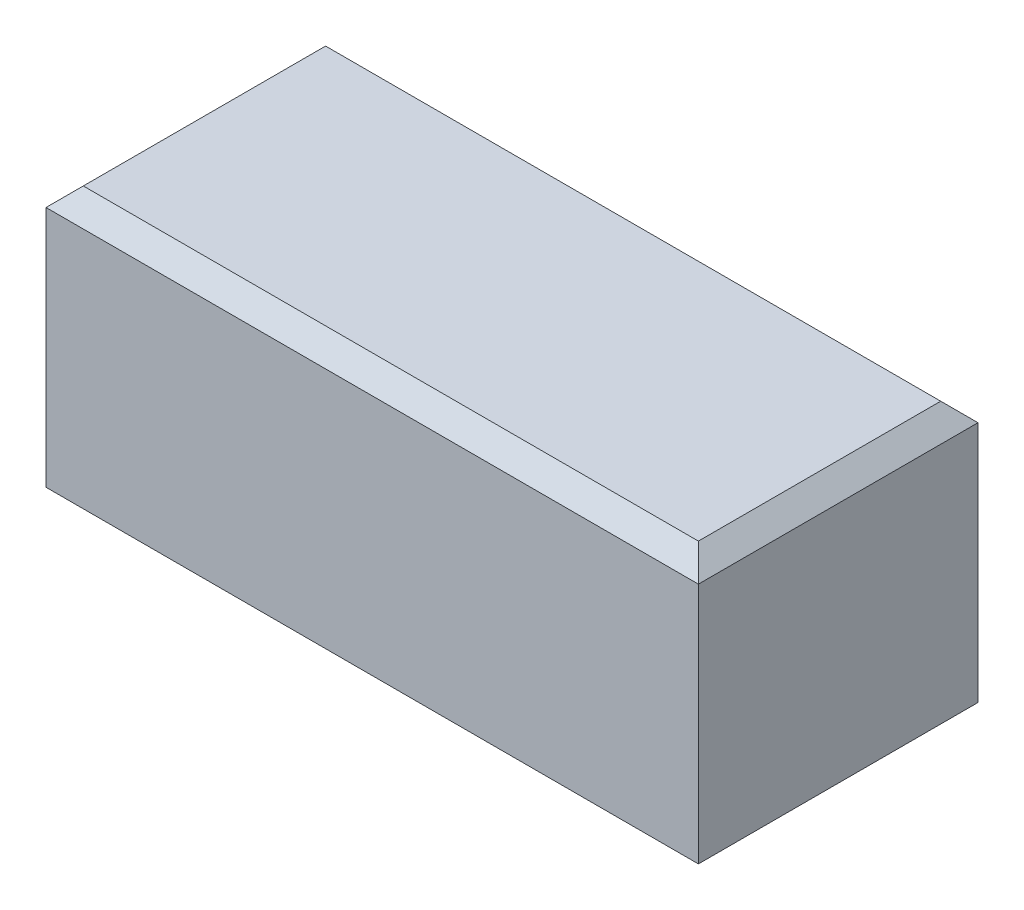
ISO-10303-21;
HEADER;
FILE_DESCRIPTION(('STEP AP214'),'2;1');
FILE_NAME('part.step','',(''),(''),'','','');
FILE_SCHEMA(('AUTOMOTIVE_DESIGN { 1 0 10303 214 1 1 1 1 }'));
ENDSEC;
DATA;
#1=APPLICATION_CONTEXT('core data for automotive mechanical design processes');
#2=APPLICATION_PROTOCOL_DEFINITION('international standard','automotive_design',2000,#1);
#3=PRODUCT_CONTEXT('',#1,'mechanical');
#4=PRODUCT('Part','Part','',(#3));
#5=PRODUCT_RELATED_PRODUCT_CATEGORY('part','',(#4));
#6=PRODUCT_DEFINITION_FORMATION('','',#4);
#7=PRODUCT_DEFINITION_CONTEXT('part definition',#1,'design');
#8=PRODUCT_DEFINITION('design','',#6,#7);
#9=PRODUCT_DEFINITION_SHAPE('','',#8);
#10=(LENGTH_UNIT() NAMED_UNIT(*) SI_UNIT(.MILLI.,.METRE.));
#11=(NAMED_UNIT(*) PLANE_ANGLE_UNIT() SI_UNIT($,.RADIAN.));
#12=(NAMED_UNIT(*) SI_UNIT($,.STERADIAN.) SOLID_ANGLE_UNIT());
#13=UNCERTAINTY_MEASURE_WITH_UNIT(LENGTH_MEASURE(1.E-05),#10,'distance_accuracy_value','');
#14=(GEOMETRIC_REPRESENTATION_CONTEXT(3) GLOBAL_UNCERTAINTY_ASSIGNED_CONTEXT((#13)) GLOBAL_UNIT_ASSIGNED_CONTEXT((#10,
#11,#12)) REPRESENTATION_CONTEXT('',''));
#15=CARTESIAN_POINT('',(0.,0.,0.));
#16=DIRECTION('',(0.,0.,1.));
#17=DIRECTION('',(1.,0.,0.));
#18=AXIS2_PLACEMENT_3D('',#15,#16,#17);
#19=CARTESIAN_POINT('',(0.2,5.8,3.));
#20=DIRECTION('',(0.707106781186548,-0.707106781186547,0.));
#21=DIRECTION('',(-0.707106781186547,-0.707106781186548,0.));
#22=AXIS2_PLACEMENT_3D('',#19,#20,#21);
#23=PLANE('',#22);
#24=DIRECTION('',(0.,0.,-1.));
#25=VECTOR('',#24,1.);
#26=CARTESIAN_POINT('',(0.,5.6,1.5));
#27=LINE('',#26,#25);
#28=CARTESIAN_POINT('',(0.,5.6,3.));
#29=VERTEX_POINT('',#28);
#30=CARTESIAN_POINT('',(0.,5.6,-3.));
#31=VERTEX_POINT('',#30);
#32=EDGE_CURVE('E34',#29,#31,#27,.T.);
#33=ORIENTED_EDGE('',*,*,#32,.F.);
#34=DIRECTION('',(-0.577350269189626,-0.577350269189626,0.577350269189626));
#35=VECTOR('',#34,1.);
#36=CARTESIAN_POINT('',(0.133333333333333,5.73333333333333,2.86666666666666));
#37=LINE('',#36,#35);
#38=CARTESIAN_POINT('',(0.4,6.,2.6));
#39=VERTEX_POINT('',#38);
#40=EDGE_CURVE('E108',#39,#29,#37,.T.);
#41=ORIENTED_EDGE('',*,*,#40,.F.);
#42=DIRECTION('',(0.,0.,1.));
#43=VECTOR('',#42,1.);
#44=CARTESIAN_POINT('',(0.4,6.,1.5));
#45=LINE('',#44,#43);
#46=CARTESIAN_POINT('',(0.4,6.,-2.6));
#47=VERTEX_POINT('',#46);
#48=EDGE_CURVE('E101',#47,#39,#45,.T.);
#49=ORIENTED_EDGE('',*,*,#48,.F.);
#50=DIRECTION('',(0.577350269189626,0.577350269189626,0.577350269189626));
#51=VECTOR('',#50,1.);
#52=CARTESIAN_POINT('',(1.13333333333333,6.73333333333333,-1.86666666666667));
#53=LINE('',#52,#51);
#54=EDGE_CURVE('E9',#31,#47,#53,.T.);
#55=ORIENTED_EDGE('',*,*,#54,.F.);
#56=EDGE_LOOP('',(#33,#41,#49,#55));
#57=FACE_BOUND('',#56,.T.);
#58=ADVANCED_FACE('F15',(#57),#23,.F.);
#59=CARTESIAN_POINT('',(0.,5.8,-2.8));
#60=DIRECTION('',(0.,0.707106781186548,-0.707106781186548));
#61=DIRECTION('',(0.,0.707106781186548,0.707106781186548));
#62=AXIS2_PLACEMENT_3D('',#59,#60,#61);
#63=PLANE('',#62);
#64=ORIENTED_EDGE('',*,*,#54,.T.);
#65=DIRECTION('',(1.,0.,0.));
#66=VECTOR('',#65,1.);
#67=CARTESIAN_POINT('',(0.,6.,-2.6));
#68=LINE('',#67,#66);
#69=CARTESIAN_POINT('',(13.6,6.,-2.6));
#70=VERTEX_POINT('',#69);
#71=EDGE_CURVE('E25',#47,#70,#68,.T.);
#72=ORIENTED_EDGE('',*,*,#71,.T.);
#73=DIRECTION('',(0.577350269189624,-0.577350269189627,-0.577350269189627));
#74=VECTOR('',#73,1.);
#75=CARTESIAN_POINT('',(10.5333333333333,9.06666666666667,0.466666666666667));
#76=LINE('',#75,#74);
#77=CARTESIAN_POINT('',(14.,5.6,-3.));
#78=VERTEX_POINT('',#77);
#79=EDGE_CURVE('E93',#70,#78,#76,.T.);
#80=ORIENTED_EDGE('',*,*,#79,.T.);
#81=DIRECTION('',(1.,0.,0.));
#82=VECTOR('',#81,1.);
#83=CARTESIAN_POINT('',(0.,5.6,-3.));
#84=LINE('',#83,#82);
#85=EDGE_CURVE('E148',#31,#78,#84,.T.);
#86=ORIENTED_EDGE('',*,*,#85,.F.);
#87=EDGE_LOOP('',(#64,#72,#80,#86));
#88=FACE_BOUND('',#87,.T.);
#89=ADVANCED_FACE('F186',(#88),#63,.T.);
#90=CARTESIAN_POINT('',(0.,6.,0.));
#91=DIRECTION('',(0.,1.,0.));
#92=DIRECTION('',(0.,0.,1.));
#93=AXIS2_PLACEMENT_3D('',#90,#91,#92);
#94=PLANE('',#93);
#95=ORIENTED_EDGE('',*,*,#48,.T.);
#96=DIRECTION('',(1.,0.,0.));
#97=VECTOR('',#96,1.);
#98=CARTESIAN_POINT('',(0.,6.,2.6));
#99=LINE('',#98,#97);
#100=CARTESIAN_POINT('',(13.6,6.,2.6));
#101=VERTEX_POINT('',#100);
#102=EDGE_CURVE('E19',#39,#101,#99,.T.);
#103=ORIENTED_EDGE('',*,*,#102,.T.);
#104=DIRECTION('',(0.,0.,-1.));
#105=VECTOR('',#104,1.);
#106=CARTESIAN_POINT('',(13.6,6.,1.5));
#107=LINE('',#106,#105);
#108=EDGE_CURVE('E86',#101,#70,#107,.T.);
#109=ORIENTED_EDGE('',*,*,#108,.T.);
#110=ORIENTED_EDGE('',*,*,#71,.F.);
#111=EDGE_LOOP('',(#95,#103,#109,#110));
#112=FACE_BOUND('',#111,.T.);
#113=ADVANCED_FACE('F17',(#112),#94,.T.);
#114=CARTESIAN_POINT('',(13.8,5.8,3.));
#115=DIRECTION('',(-0.707106781186549,-0.707106781186546,0.));
#116=DIRECTION('',(-0.707106781186546,0.707106781186549,0.));
#117=AXIS2_PLACEMENT_3D('',#114,#115,#116);
#118=PLANE('',#117);
#119=DIRECTION('',(-0.577350269189625,0.577350269189627,-0.577350269189626));
#120=VECTOR('',#119,1.);
#121=CARTESIAN_POINT('',(11.5333333333333,8.06666666666667,0.533333333333338));
#122=LINE('',#121,#120);
#123=CARTESIAN_POINT('',(14.,5.6,3.));
#124=VERTEX_POINT('',#123);
#125=EDGE_CURVE('E91',#124,#101,#122,.T.);
#126=ORIENTED_EDGE('',*,*,#125,.F.);
#127=DIRECTION('',(0.,0.,1.));
#128=VECTOR('',#127,1.);
#129=CARTESIAN_POINT('',(14.,5.6,1.5));
#130=LINE('',#129,#128);
#131=EDGE_CURVE('E97',#78,#124,#130,.T.);
#132=ORIENTED_EDGE('',*,*,#131,.F.);
#133=ORIENTED_EDGE('',*,*,#79,.F.);
#134=ORIENTED_EDGE('',*,*,#108,.F.);
#135=EDGE_LOOP('',(#126,#132,#133,#134));
#136=FACE_BOUND('',#135,.T.);
#137=ADVANCED_FACE('F88',(#136),#118,.F.);
#138=CARTESIAN_POINT('',(14.,3.,0.));
#139=DIRECTION('',(1.,0.,0.));
#140=DIRECTION('',(0.,0.,-1.));
#141=AXIS2_PLACEMENT_3D('',#138,#139,#140);
#142=PLANE('',#141);
#143=ORIENTED_EDGE('',*,*,#131,.T.);
#144=DIRECTION('',(0.,1.,0.));
#145=VECTOR('',#144,1.);
#146=CARTESIAN_POINT('',(14.,5.6,3.));
#147=LINE('',#146,#145);
#148=CARTESIAN_POINT('',(14.,0.4,3.));
#149=VERTEX_POINT('',#148);
#150=EDGE_CURVE('E64',#149,#124,#147,.T.);
#151=ORIENTED_EDGE('',*,*,#150,.F.);
#152=DIRECTION('',(0.,0.,-1.));
#153=VECTOR('',#152,1.);
#154=CARTESIAN_POINT('',(14.,0.4,1.5));
#155=LINE('',#154,#153);
#156=CARTESIAN_POINT('',(14.,0.4,-3.));
#157=VERTEX_POINT('',#156);
#158=EDGE_CURVE('E135',#149,#157,#155,.T.);
#159=ORIENTED_EDGE('',*,*,#158,.T.);
#160=DIRECTION('',(0.,-1.,0.));
#161=VECTOR('',#160,1.);
#162=CARTESIAN_POINT('',(14.,0.4,-3.));
#163=LINE('',#162,#161);
#164=EDGE_CURVE('E74',#78,#157,#163,.T.);
#165=ORIENTED_EDGE('',*,*,#164,.F.);
#166=EDGE_LOOP('',(#143,#151,#159,#165));
#167=FACE_BOUND('',#166,.T.);
#168=ADVANCED_FACE('F193',(#167),#142,.T.);
#169=CARTESIAN_POINT('',(13.8,0.2,3.));
#170=DIRECTION('',(-0.707106781186549,0.707106781186547,0.));
#171=DIRECTION('',(0.707106781186547,0.707106781186549,0.));
#172=AXIS2_PLACEMENT_3D('',#169,#170,#171);
#173=PLANE('',#172);
#174=ORIENTED_EDGE('',*,*,#158,.F.);
#175=DIRECTION('',(0.577350269189625,0.577350269189626,0.577350269189626));
#176=VECTOR('',#175,1.);
#177=CARTESIAN_POINT('',(11.5333333333333,-2.06666666666667,0.533333333333335));
#178=LINE('',#177,#176);
#179=CARTESIAN_POINT('',(13.6,0.,2.6));
#180=VERTEX_POINT('',#179);
#181=EDGE_CURVE('E117',#180,#149,#178,.T.);
#182=ORIENTED_EDGE('',*,*,#181,.F.);
#183=DIRECTION('',(0.,0.,1.));
#184=VECTOR('',#183,1.);
#185=CARTESIAN_POINT('',(13.6,0.,1.5));
#186=LINE('',#185,#184);
#187=CARTESIAN_POINT('',(13.6,0.,-2.6));
#188=VERTEX_POINT('',#187);
#189=EDGE_CURVE('E129',#188,#180,#186,.T.);
#190=ORIENTED_EDGE('',*,*,#189,.F.);
#191=DIRECTION('',(-0.577350269189624,-0.577350269189626,0.577350269189627));
#192=VECTOR('',#191,1.);
#193=CARTESIAN_POINT('',(10.5333333333333,-3.06666666666667,0.466666666666669));
#194=LINE('',#193,#192);
#195=EDGE_CURVE('E132',#157,#188,#194,.T.);
#196=ORIENTED_EDGE('',*,*,#195,.F.);
#197=EDGE_LOOP('',(#174,#182,#190,#196));
#198=FACE_BOUND('',#197,.T.);
#199=ADVANCED_FACE('F201',(#198),#173,.F.);
#200=CARTESIAN_POINT('',(0.,0.2,-2.8));
#201=DIRECTION('',(0.,-0.707106781186548,-0.707106781186547));
#202=DIRECTION('',(0.,0.707106781186547,-0.707106781186548));
#203=AXIS2_PLACEMENT_3D('',#200,#201,#202);
#204=PLANE('',#203);
#205=ORIENTED_EDGE('',*,*,#195,.T.);
#206=DIRECTION('',(1.,0.,0.));
#207=VECTOR('',#206,1.);
#208=CARTESIAN_POINT('',(0.,0.,-2.6));
#209=LINE('',#208,#207);
#210=CARTESIAN_POINT('',(0.4,0.,-2.6));
#211=VERTEX_POINT('',#210);
#212=EDGE_CURVE('E130',#211,#188,#209,.T.);
#213=ORIENTED_EDGE('',*,*,#212,.F.);
#214=DIRECTION('',(-0.577350269189626,0.577350269189626,-0.577350269189626));
#215=VECTOR('',#214,1.);
#216=CARTESIAN_POINT('',(1.13333333333333,-0.733333333333334,-1.86666666666667));
#217=LINE('',#216,#215);
#218=CARTESIAN_POINT('',(0.,0.4,-3.));
#219=VERTEX_POINT('',#218);
#220=EDGE_CURVE('E136',#211,#219,#217,.T.);
#221=ORIENTED_EDGE('',*,*,#220,.T.);
#222=DIRECTION('',(1.,0.,0.));
#223=VECTOR('',#222,1.);
#224=CARTESIAN_POINT('',(0.,0.4,-3.));
#225=LINE('',#224,#223);
#226=EDGE_CURVE('E143',#219,#157,#225,.T.);
#227=ORIENTED_EDGE('',*,*,#226,.T.);
#228=EDGE_LOOP('',(#205,#213,#221,#227));
#229=FACE_BOUND('',#228,.T.);
#230=ADVANCED_FACE('F168',(#229),#204,.T.);
#231=CARTESIAN_POINT('',(0.,0.,0.));
#232=DIRECTION('',(0.,-1.,0.));
#233=DIRECTION('',(0.,0.,-1.));
#234=AXIS2_PLACEMENT_3D('',#231,#232,#233);
#235=PLANE('',#234);
#236=ORIENTED_EDGE('',*,*,#189,.T.);
#237=DIRECTION('',(1.,0.,0.));
#238=VECTOR('',#237,1.);
#239=CARTESIAN_POINT('',(0.,0.,2.6));
#240=LINE('',#239,#238);
#241=CARTESIAN_POINT('',(0.4,0.,2.6));
#242=VERTEX_POINT('',#241);
#243=EDGE_CURVE('E118',#242,#180,#240,.T.);
#244=ORIENTED_EDGE('',*,*,#243,.F.);
#245=DIRECTION('',(0.,0.,-1.));
#246=VECTOR('',#245,1.);
#247=CARTESIAN_POINT('',(0.4,0.,1.5));
#248=LINE('',#247,#246);
#249=EDGE_CURVE('E126',#242,#211,#248,.T.);
#250=ORIENTED_EDGE('',*,*,#249,.T.);
#251=ORIENTED_EDGE('',*,*,#212,.T.);
#252=EDGE_LOOP('',(#236,#244,#250,#251));
#253=FACE_BOUND('',#252,.T.);
#254=ADVANCED_FACE('F234',(#253),#235,.T.);
#255=CARTESIAN_POINT('',(0.2,0.2,3.));
#256=DIRECTION('',(0.707106781186548,0.707106781186548,0.));
#257=DIRECTION('',(0.707106781186548,-0.707106781186548,0.));
#258=AXIS2_PLACEMENT_3D('',#255,#256,#257);
#259=PLANE('',#258);
#260=DIRECTION('',(0.,0.,1.));
#261=VECTOR('',#260,1.);
#262=CARTESIAN_POINT('',(0.,0.4,1.5));
#263=LINE('',#262,#261);
#264=CARTESIAN_POINT('',(0.,0.4,3.));
#265=VERTEX_POINT('',#264);
#266=EDGE_CURVE('E137',#219,#265,#263,.T.);
#267=ORIENTED_EDGE('',*,*,#266,.F.);
#268=ORIENTED_EDGE('',*,*,#220,.F.);
#269=ORIENTED_EDGE('',*,*,#249,.F.);
#270=DIRECTION('',(0.577350269189626,-0.577350269189626,-0.577350269189626));
#271=VECTOR('',#270,1.);
#272=CARTESIAN_POINT('',(0.133333333333333,0.266666666666666,2.86666666666666));
#273=LINE('',#272,#271);
#274=EDGE_CURVE('E114',#265,#242,#273,.T.);
#275=ORIENTED_EDGE('',*,*,#274,.F.);
#276=EDGE_LOOP('',(#267,#268,#269,#275));
#277=FACE_BOUND('',#276,.T.);
#278=ADVANCED_FACE('F240',(#277),#259,.F.);
#279=CARTESIAN_POINT('',(0.,0.2,2.8));
#280=DIRECTION('',(0.,-0.707106781186548,0.707106781186548));
#281=DIRECTION('',(0.,-0.707106781186548,-0.707106781186548));
#282=AXIS2_PLACEMENT_3D('',#279,#280,#281);
#283=PLANE('',#282);
#284=ORIENTED_EDGE('',*,*,#181,.T.);
#285=DIRECTION('',(1.,0.,0.));
#286=VECTOR('',#285,1.);
#287=CARTESIAN_POINT('',(0.,0.4,3.));
#288=LINE('',#287,#286);
#289=EDGE_CURVE('E122',#265,#149,#288,.T.);
#290=ORIENTED_EDGE('',*,*,#289,.F.);
#291=ORIENTED_EDGE('',*,*,#274,.T.);
#292=ORIENTED_EDGE('',*,*,#243,.T.);
#293=EDGE_LOOP('',(#284,#290,#291,#292));
#294=FACE_BOUND('',#293,.T.);
#295=ADVANCED_FACE('F247',(#294),#283,.T.);
#296=CARTESIAN_POINT('',(0.,3.,3.));
#297=DIRECTION('',(0.,0.,1.));
#298=DIRECTION('',(0.,-1.,0.));
#299=AXIS2_PLACEMENT_3D('',#296,#297,#298);
#300=PLANE('',#299);
#301=ORIENTED_EDGE('',*,*,#150,.T.);
#302=DIRECTION('',(1.,0.,0.));
#303=VECTOR('',#302,1.);
#304=CARTESIAN_POINT('',(0.,5.6,3.));
#305=LINE('',#304,#303);
#306=EDGE_CURVE('E106',#29,#124,#305,.T.);
#307=ORIENTED_EDGE('',*,*,#306,.F.);
#308=DIRECTION('',(0.,-1.,0.));
#309=VECTOR('',#308,1.);
#310=CARTESIAN_POINT('',(0.,5.6,3.));
#311=LINE('',#310,#309);
#312=EDGE_CURVE('E125',#29,#265,#311,.T.);
#313=ORIENTED_EDGE('',*,*,#312,.T.);
#314=ORIENTED_EDGE('',*,*,#289,.T.);
#315=EDGE_LOOP('',(#301,#307,#313,#314));
#316=FACE_BOUND('',#315,.T.);
#317=ADVANCED_FACE('F182',(#316),#300,.T.);
#318=CARTESIAN_POINT('',(0.,5.8,2.8));
#319=DIRECTION('',(0.,0.707106781186547,0.707106781186548));
#320=DIRECTION('',(0.,-0.707106781186548,0.707106781186547));
#321=AXIS2_PLACEMENT_3D('',#318,#319,#320);
#322=PLANE('',#321);
#323=ORIENTED_EDGE('',*,*,#40,.T.);
#324=ORIENTED_EDGE('',*,*,#306,.T.);
#325=ORIENTED_EDGE('',*,*,#125,.T.);
#326=ORIENTED_EDGE('',*,*,#102,.F.);
#327=EDGE_LOOP('',(#323,#324,#325,#326));
#328=FACE_BOUND('',#327,.T.);
#329=ADVANCED_FACE('F105',(#328),#322,.T.);
#330=CARTESIAN_POINT('',(0.,3.,-3.));
#331=DIRECTION('',(0.,0.,-1.));
#332=DIRECTION('',(0.,1.,0.));
#333=AXIS2_PLACEMENT_3D('',#330,#331,#332);
#334=PLANE('',#333);
#335=ORIENTED_EDGE('',*,*,#164,.T.);
#336=ORIENTED_EDGE('',*,*,#226,.F.);
#337=DIRECTION('',(0.,1.,0.));
#338=VECTOR('',#337,1.);
#339=CARTESIAN_POINT('',(0.,0.4,-3.));
#340=LINE('',#339,#338);
#341=EDGE_CURVE('E110',#219,#31,#340,.T.);
#342=ORIENTED_EDGE('',*,*,#341,.T.);
#343=ORIENTED_EDGE('',*,*,#85,.T.);
#344=EDGE_LOOP('',(#335,#336,#342,#343));
#345=FACE_BOUND('',#344,.T.);
#346=ADVANCED_FACE('F173',(#345),#334,.T.);
#347=CARTESIAN_POINT('',(0.,3.,0.));
#348=DIRECTION('',(1.,0.,0.));
#349=DIRECTION('',(0.,0.,-1.));
#350=AXIS2_PLACEMENT_3D('',#347,#348,#349);
#351=PLANE('',#350);
#352=ORIENTED_EDGE('',*,*,#32,.T.);
#353=ORIENTED_EDGE('',*,*,#341,.F.);
#354=ORIENTED_EDGE('',*,*,#266,.T.);
#355=ORIENTED_EDGE('',*,*,#312,.F.);
#356=EDGE_LOOP('',(#352,#353,#354,#355));
#357=FACE_BOUND('',#356,.T.);
#358=ADVANCED_FACE('F172',(#357),#351,.F.);
#359=CLOSED_SHELL('',(#58,#89,#113,#137,#168,#199,#230,#254,#278,#295,#317,#329,#346,#358));
#360=MANIFOLD_SOLID_BREP('B1',#359);
#361=ADVANCED_BREP_SHAPE_REPRESENTATION('',(#18,#360),#14);
#362=SHAPE_DEFINITION_REPRESENTATION(#9,#361);
ENDSEC;
END-ISO-10303-21;
